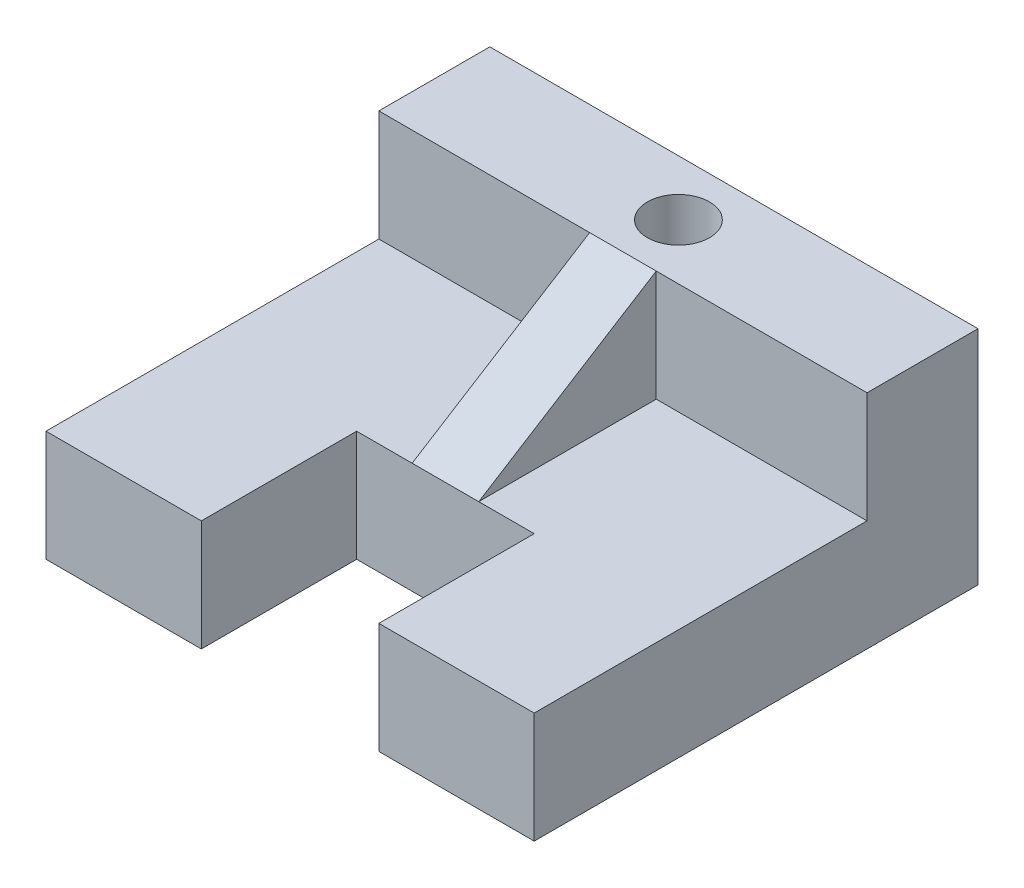
ISO-10303-21;
HEADER;
FILE_DESCRIPTION(('STEP AP214'),'2;1');
FILE_NAME('part.step','',(''),(''),'','','');
FILE_SCHEMA(('AUTOMOTIVE_DESIGN { 1 0 10303 214 1 1 1 1 }'));
ENDSEC;
DATA;
#1=APPLICATION_CONTEXT('core data for automotive mechanical design processes');
#2=APPLICATION_PROTOCOL_DEFINITION('international standard','automotive_design',2000,#1);
#3=PRODUCT_CONTEXT('',#1,'mechanical');
#4=PRODUCT('Part','Part','',(#3));
#5=PRODUCT_RELATED_PRODUCT_CATEGORY('part','',(#4));
#6=PRODUCT_DEFINITION_FORMATION('','',#4);
#7=PRODUCT_DEFINITION_CONTEXT('part definition',#1,'design');
#8=PRODUCT_DEFINITION('design','',#6,#7);
#9=PRODUCT_DEFINITION_SHAPE('','',#8);
#10=(LENGTH_UNIT() NAMED_UNIT(*) SI_UNIT(.MILLI.,.METRE.));
#11=(NAMED_UNIT(*) PLANE_ANGLE_UNIT() SI_UNIT($,.RADIAN.));
#12=(NAMED_UNIT(*) SI_UNIT($,.STERADIAN.) SOLID_ANGLE_UNIT());
#13=UNCERTAINTY_MEASURE_WITH_UNIT(LENGTH_MEASURE(1.E-05),#10,'distance_accuracy_value','');
#14=(GEOMETRIC_REPRESENTATION_CONTEXT(3) GLOBAL_UNCERTAINTY_ASSIGNED_CONTEXT((#13)) GLOBAL_UNIT_ASSIGNED_CONTEXT((#10,
#11,#12)) REPRESENTATION_CONTEXT('',''));
#15=CARTESIAN_POINT('',(0.,0.,0.));
#16=DIRECTION('',(0.,0.,1.));
#17=DIRECTION('',(1.,0.,0.));
#18=AXIS2_PLACEMENT_3D('',#15,#16,#17);
#19=CARTESIAN_POINT('',(0.,25.,0.));
#20=DIRECTION('',(0.,-1.,0.));
#21=DIRECTION('',(0.,0.,-1.));
#22=AXIS2_PLACEMENT_3D('',#19,#20,#21);
#23=PLANE('',#22);
#24=DIRECTION('',(0.,0.,1.));
#25=VECTOR('',#24,1.);
#26=CARTESIAN_POINT('',(-7.5,25.,0.));
#27=LINE('',#26,#25);
#28=CARTESIAN_POINT('',(-7.5,25.,-25.));
#29=VERTEX_POINT('',#28);
#30=CARTESIAN_POINT('',(-7.5,25.,15.));
#31=VERTEX_POINT('',#30);
#32=EDGE_CURVE('E149',#29,#31,#27,.T.);
#33=ORIENTED_EDGE('',*,*,#32,.F.);
#34=DIRECTION('',(1.,0.,0.));
#35=VECTOR('',#34,1.);
#36=CARTESIAN_POINT('',(55.,25.,-25.));
#37=LINE('',#36,#35);
#38=CARTESIAN_POINT('',(-55.,25.,-25.));
#39=VERTEX_POINT('',#38);
#40=EDGE_CURVE('E159',#39,#29,#37,.T.);
#41=ORIENTED_EDGE('',*,*,#40,.F.);
#42=DIRECTION('',(0.,0.,1.));
#43=VECTOR('',#42,1.);
#44=CARTESIAN_POINT('',(-55.,25.,50.));
#45=LINE('',#44,#43);
#46=CARTESIAN_POINT('',(-55.,25.,50.));
#47=VERTEX_POINT('',#46);
#48=EDGE_CURVE('E182',#39,#47,#45,.T.);
#49=ORIENTED_EDGE('',*,*,#48,.T.);
#50=DIRECTION('',(1.,0.,0.));
#51=VECTOR('',#50,1.);
#52=CARTESIAN_POINT('',(-55.,25.,50.));
#53=LINE('',#52,#51);
#54=CARTESIAN_POINT('',(-20.,25.,50.));
#55=VERTEX_POINT('',#54);
#56=EDGE_CURVE('E198',#47,#55,#53,.T.);
#57=ORIENTED_EDGE('',*,*,#56,.T.);
#58=DIRECTION('',(0.,0.,1.));
#59=VECTOR('',#58,1.);
#60=CARTESIAN_POINT('',(-20.,25.,15.));
#61=LINE('',#60,#59);
#62=CARTESIAN_POINT('',(-20.,25.,15.));
#63=VERTEX_POINT('',#62);
#64=EDGE_CURVE('E226',#63,#55,#61,.T.);
#65=ORIENTED_EDGE('',*,*,#64,.F.);
#66=DIRECTION('',(-1.,0.,0.));
#67=VECTOR('',#66,1.);
#68=CARTESIAN_POINT('',(-20.,25.,15.));
#69=LINE('',#68,#67);
#70=EDGE_CURVE('E263',#31,#63,#69,.T.);
#71=ORIENTED_EDGE('',*,*,#70,.F.);
#72=EDGE_LOOP('',(#33,#41,#49,#57,#65,#71));
#73=FACE_BOUND('',#72,.T.);
#74=ADVANCED_FACE('F35',(#73),#23,.F.);
#75=CARTESIAN_POINT('',(55.,50.,-25.));
#76=DIRECTION('',(0.,0.,-1.));
#77=DIRECTION('',(-1.,0.,0.));
#78=AXIS2_PLACEMENT_3D('',#75,#76,#77);
#79=PLANE('',#78);
#80=DIRECTION('',(0.,-1.,0.));
#81=VECTOR('',#80,1.);
#82=CARTESIAN_POINT('',(-7.49999999999999,50.,-25.));
#83=LINE('',#82,#81);
#84=CARTESIAN_POINT('',(-7.5,50.,-25.));
#85=VERTEX_POINT('',#84);
#86=EDGE_CURVE('E147',#85,#29,#83,.T.);
#87=ORIENTED_EDGE('',*,*,#86,.F.);
#88=DIRECTION('',(1.,0.,0.));
#89=VECTOR('',#88,1.);
#90=CARTESIAN_POINT('',(55.,50.,-25.));
#91=LINE('',#90,#89);
#92=CARTESIAN_POINT('',(-55.,50.,-25.));
#93=VERTEX_POINT('',#92);
#94=EDGE_CURVE('E158',#93,#85,#91,.T.);
#95=ORIENTED_EDGE('',*,*,#94,.F.);
#96=DIRECTION('',(0.,-1.,0.));
#97=VECTOR('',#96,1.);
#98=CARTESIAN_POINT('',(-55.,50.,-25.));
#99=LINE('',#98,#97);
#100=EDGE_CURVE('E170',#93,#39,#99,.T.);
#101=ORIENTED_EDGE('',*,*,#100,.T.);
#102=ORIENTED_EDGE('',*,*,#40,.T.);
#103=EDGE_LOOP('',(#87,#95,#101,#102));
#104=FACE_BOUND('',#103,.T.);
#105=ADVANCED_FACE('F156',(#104),#79,.F.);
#106=CARTESIAN_POINT('',(-55.,25.,50.));
#107=DIRECTION('',(0.,0.,-1.));
#108=DIRECTION('',(-1.,0.,0.));
#109=AXIS2_PLACEMENT_3D('',#106,#107,#108);
#110=PLANE('',#109);
#111=CARTESIAN_POINT('',(20.,25.,50.));
#112=VERTEX_POINT('',#111);
#113=CARTESIAN_POINT('',(55.,25.,50.));
#114=VERTEX_POINT('',#113);
#115=EDGE_CURVE('E216',#112,#114,#53,.T.);
#116=ORIENTED_EDGE('',*,*,#115,.F.);
#117=DIRECTION('',(0.,1.,0.));
#118=VECTOR('',#117,1.);
#119=CARTESIAN_POINT('',(20.,0.,50.));
#120=LINE('',#119,#118);
#121=CARTESIAN_POINT('',(20.,0.,50.));
#122=VERTEX_POINT('',#121);
#123=EDGE_CURVE('E233',#122,#112,#120,.T.);
#124=ORIENTED_EDGE('',*,*,#123,.F.);
#125=DIRECTION('',(1.,0.,0.));
#126=VECTOR('',#125,1.);
#127=CARTESIAN_POINT('',(-55.,0.,50.));
#128=LINE('',#127,#126);
#129=CARTESIAN_POINT('',(55.,0.,50.));
#130=VERTEX_POINT('',#129);
#131=EDGE_CURVE('E201',#122,#130,#128,.T.);
#132=ORIENTED_EDGE('',*,*,#131,.T.);
#133=DIRECTION('',(0.,-1.,0.));
#134=VECTOR('',#133,1.);
#135=CARTESIAN_POINT('',(55.,25.,50.));
#136=LINE('',#135,#134);
#137=EDGE_CURVE('E206',#114,#130,#136,.T.);
#138=ORIENTED_EDGE('',*,*,#137,.F.);
#139=EDGE_LOOP('',(#116,#124,#132,#138));
#140=FACE_BOUND('',#139,.T.);
#141=ADVANCED_FACE('F307',(#140),#110,.F.);
#142=CARTESIAN_POINT('',(7.5,25.,-25.));
#143=VERTEX_POINT('',#142);
#144=CARTESIAN_POINT('',(55.,25.,-25.));
#145=VERTEX_POINT('',#144);
#146=EDGE_CURVE('E39',#143,#145,#37,.T.);
#147=ORIENTED_EDGE('',*,*,#146,.F.);
#148=DIRECTION('',(0.,0.,1.));
#149=VECTOR('',#148,1.);
#150=CARTESIAN_POINT('',(7.5,25.,0.));
#151=LINE('',#150,#149);
#152=CARTESIAN_POINT('',(7.5,25.,15.));
#153=VERTEX_POINT('',#152);
#154=EDGE_CURVE('E160',#143,#153,#151,.T.);
#155=ORIENTED_EDGE('',*,*,#154,.T.);
#156=CARTESIAN_POINT('',(20.,25.,15.));
#157=VERTEX_POINT('',#156);
#158=EDGE_CURVE('E264',#157,#153,#69,.T.);
#159=ORIENTED_EDGE('',*,*,#158,.F.);
#160=DIRECTION('',(0.,0.,-1.));
#161=VECTOR('',#160,1.);
#162=CARTESIAN_POINT('',(20.,25.,15.));
#163=LINE('',#162,#161);
#164=EDGE_CURVE('E141',#112,#157,#163,.T.);
#165=ORIENTED_EDGE('',*,*,#164,.F.);
#166=ORIENTED_EDGE('',*,*,#115,.T.);
#167=DIRECTION('',(0.,0.,-1.));
#168=VECTOR('',#167,1.);
#169=CARTESIAN_POINT('',(55.,25.,50.));
#170=LINE('',#169,#168);
#171=EDGE_CURVE('E205',#114,#145,#170,.T.);
#172=ORIENTED_EDGE('',*,*,#171,.T.);
#173=EDGE_LOOP('',(#147,#155,#159,#165,#166,#172));
#174=FACE_BOUND('',#173,.T.);
#175=ADVANCED_FACE('F303',(#174),#23,.F.);
#176=CARTESIAN_POINT('',(55.,25.,50.));
#177=DIRECTION('',(-1.,0.,0.));
#178=DIRECTION('',(0.,0.,1.));
#179=AXIS2_PLACEMENT_3D('',#176,#177,#178);
#180=PLANE('',#179);
#181=DIRECTION('',(0.,0.,-1.));
#182=VECTOR('',#181,1.);
#183=CARTESIAN_POINT('',(55.,0.,50.));
#184=LINE('',#183,#182);
#185=CARTESIAN_POINT('',(55.,0.,-50.));
#186=VERTEX_POINT('',#185);
#187=EDGE_CURVE('E187',#130,#186,#184,.T.);
#188=ORIENTED_EDGE('',*,*,#187,.T.);
#189=DIRECTION('',(0.,-1.,0.));
#190=VECTOR('',#189,1.);
#191=CARTESIAN_POINT('',(55.,25.,-50.));
#192=LINE('',#191,#190);
#193=CARTESIAN_POINT('',(55.,50.,-50.));
#194=VERTEX_POINT('',#193);
#195=EDGE_CURVE('E11',#194,#186,#192,.T.);
#196=ORIENTED_EDGE('',*,*,#195,.F.);
#197=DIRECTION('',(0.,0.,-1.));
#198=VECTOR('',#197,1.);
#199=CARTESIAN_POINT('',(55.,50.,-50.));
#200=LINE('',#199,#198);
#201=CARTESIAN_POINT('',(55.,50.,-25.));
#202=VERTEX_POINT('',#201);
#203=EDGE_CURVE('E181',#202,#194,#200,.T.);
#204=ORIENTED_EDGE('',*,*,#203,.F.);
#205=DIRECTION('',(0.,-1.,0.));
#206=VECTOR('',#205,1.);
#207=CARTESIAN_POINT('',(55.,50.,-25.));
#208=LINE('',#207,#206);
#209=EDGE_CURVE('E166',#202,#145,#208,.T.);
#210=ORIENTED_EDGE('',*,*,#209,.T.);
#211=ORIENTED_EDGE('',*,*,#171,.F.);
#212=ORIENTED_EDGE('',*,*,#137,.T.);
#213=EDGE_LOOP('',(#188,#196,#204,#210,#211,#212));
#214=FACE_BOUND('',#213,.T.);
#215=ADVANCED_FACE('F37',(#214),#180,.F.);
#216=CARTESIAN_POINT('',(-55.,25.,-50.));
#217=DIRECTION('',(0.,0.,1.));
#218=DIRECTION('',(1.,0.,0.));
#219=AXIS2_PLACEMENT_3D('',#216,#217,#218);
#220=PLANE('',#219);
#221=DIRECTION('',(-1.,0.,0.));
#222=VECTOR('',#221,1.);
#223=CARTESIAN_POINT('',(-55.,0.,-50.));
#224=LINE('',#223,#222);
#225=CARTESIAN_POINT('',(-55.,0.,-50.));
#226=VERTEX_POINT('',#225);
#227=EDGE_CURVE('E190',#186,#226,#224,.T.);
#228=ORIENTED_EDGE('',*,*,#227,.T.);
#229=DIRECTION('',(0.,-1.,0.));
#230=VECTOR('',#229,1.);
#231=CARTESIAN_POINT('',(-55.,25.,-50.));
#232=LINE('',#231,#230);
#233=CARTESIAN_POINT('',(-55.,50.,-50.));
#234=VERTEX_POINT('',#233);
#235=EDGE_CURVE('E45',#234,#226,#232,.T.);
#236=ORIENTED_EDGE('',*,*,#235,.F.);
#237=DIRECTION('',(-1.,0.,0.));
#238=VECTOR('',#237,1.);
#239=CARTESIAN_POINT('',(55.,50.,-50.));
#240=LINE('',#239,#238);
#241=EDGE_CURVE('E245',#194,#234,#240,.T.);
#242=ORIENTED_EDGE('',*,*,#241,.F.);
#243=ORIENTED_EDGE('',*,*,#195,.T.);
#244=EDGE_LOOP('',(#228,#236,#242,#243));
#245=FACE_BOUND('',#244,.T.);
#246=ADVANCED_FACE('F250',(#245),#220,.F.);
#247=CARTESIAN_POINT('',(-55.,25.,50.));
#248=DIRECTION('',(1.,0.,0.));
#249=DIRECTION('',(0.,0.,-1.));
#250=AXIS2_PLACEMENT_3D('',#247,#248,#249);
#251=PLANE('',#250);
#252=DIRECTION('',(0.,0.,1.));
#253=VECTOR('',#252,1.);
#254=CARTESIAN_POINT('',(-55.,0.,50.));
#255=LINE('',#254,#253);
#256=CARTESIAN_POINT('',(-55.,0.,50.));
#257=VERTEX_POINT('',#256);
#258=EDGE_CURVE('E195',#226,#257,#255,.T.);
#259=ORIENTED_EDGE('',*,*,#258,.T.);
#260=DIRECTION('',(0.,-1.,0.));
#261=VECTOR('',#260,1.);
#262=CARTESIAN_POINT('',(-55.,25.,50.));
#263=LINE('',#262,#261);
#264=EDGE_CURVE('E208',#47,#257,#263,.T.);
#265=ORIENTED_EDGE('',*,*,#264,.F.);
#266=ORIENTED_EDGE('',*,*,#48,.F.);
#267=ORIENTED_EDGE('',*,*,#100,.F.);
#268=DIRECTION('',(0.,0.,1.));
#269=VECTOR('',#268,1.);
#270=CARTESIAN_POINT('',(-55.,50.,-50.));
#271=LINE('',#270,#269);
#272=EDGE_CURVE('E164',#234,#93,#271,.T.);
#273=ORIENTED_EDGE('',*,*,#272,.F.);
#274=ORIENTED_EDGE('',*,*,#235,.T.);
#275=EDGE_LOOP('',(#259,#265,#266,#267,#273,#274));
#276=FACE_BOUND('',#275,.T.);
#277=ADVANCED_FACE('F253',(#276),#251,.F.);
#278=CARTESIAN_POINT('',(-20.,0.,50.));
#279=VERTEX_POINT('',#278);
#280=EDGE_CURVE('E202',#257,#279,#128,.T.);
#281=ORIENTED_EDGE('',*,*,#280,.T.);
#282=DIRECTION('',(0.,1.,0.));
#283=VECTOR('',#282,1.);
#284=CARTESIAN_POINT('',(-20.,0.,50.));
#285=LINE('',#284,#283);
#286=EDGE_CURVE('E231',#279,#55,#285,.T.);
#287=ORIENTED_EDGE('',*,*,#286,.T.);
#288=ORIENTED_EDGE('',*,*,#56,.F.);
#289=ORIENTED_EDGE('',*,*,#264,.T.);
#290=EDGE_LOOP('',(#281,#287,#288,#289));
#291=FACE_BOUND('',#290,.T.);
#292=ADVANCED_FACE('F229',(#291),#110,.F.);
#293=CARTESIAN_POINT('',(0.,0.,0.));
#294=DIRECTION('',(0.,-1.,0.));
#295=DIRECTION('',(0.,0.,-1.));
#296=AXIS2_PLACEMENT_3D('',#293,#294,#295);
#297=PLANE('',#296);
#298=CARTESIAN_POINT('',(0.,0.,-37.5));
#299=DIRECTION('',(0.,1.,0.));
#300=DIRECTION('',(0.,0.,1.));
#301=AXIS2_PLACEMENT_3D('',#298,#299,#300);
#302=CIRCLE('',#301,7.);
#303=CARTESIAN_POINT('',(0.,0.,-30.5));
#304=VERTEX_POINT('',#303);
#305=EDGE_CURVE('E151',#304,#304,#302,.T.);
#306=ORIENTED_EDGE('',*,*,#305,.T.);
#307=EDGE_LOOP('',(#306));
#308=FACE_BOUND('',#307,.T.);
#309=DIRECTION('',(-1.,0.,0.));
#310=VECTOR('',#309,1.);
#311=CARTESIAN_POINT('',(-20.,0.,15.));
#312=LINE('',#311,#310);
#313=CARTESIAN_POINT('',(20.,0.,15.));
#314=VERTEX_POINT('',#313);
#315=CARTESIAN_POINT('',(-20.,0.,15.));
#316=VERTEX_POINT('',#315);
#317=EDGE_CURVE('E61',#314,#316,#312,.T.);
#318=ORIENTED_EDGE('',*,*,#317,.T.);
#319=DIRECTION('',(0.,0.,1.));
#320=VECTOR('',#319,1.);
#321=CARTESIAN_POINT('',(-20.,0.,15.));
#322=LINE('',#321,#320);
#323=EDGE_CURVE('E243',#316,#279,#322,.T.);
#324=ORIENTED_EDGE('',*,*,#323,.T.);
#325=ORIENTED_EDGE('',*,*,#280,.F.);
#326=ORIENTED_EDGE('',*,*,#258,.F.);
#327=ORIENTED_EDGE('',*,*,#227,.F.);
#328=ORIENTED_EDGE('',*,*,#187,.F.);
#329=ORIENTED_EDGE('',*,*,#131,.F.);
#330=DIRECTION('',(0.,0.,-1.));
#331=VECTOR('',#330,1.);
#332=CARTESIAN_POINT('',(20.,0.,15.));
#333=LINE('',#332,#331);
#334=EDGE_CURVE('E257',#122,#314,#333,.T.);
#335=ORIENTED_EDGE('',*,*,#334,.T.);
#336=EDGE_LOOP('',(#318,#324,#325,#326,#327,#328,#329,#335));
#337=FACE_BOUND('',#336,.T.);
#338=ADVANCED_FACE('F254',(#308,#337),#297,.T.);
#339=CARTESIAN_POINT('',(7.5,50.,-25.));
#340=VERTEX_POINT('',#339);
#341=EDGE_CURVE('E167',#340,#202,#91,.T.);
#342=ORIENTED_EDGE('',*,*,#341,.F.);
#343=DIRECTION('',(0.,-1.,0.));
#344=VECTOR('',#343,1.);
#345=CARTESIAN_POINT('',(7.5,50.,-25.));
#346=LINE('',#345,#344);
#347=EDGE_CURVE('E142',#340,#143,#346,.T.);
#348=ORIENTED_EDGE('',*,*,#347,.T.);
#349=ORIENTED_EDGE('',*,*,#146,.T.);
#350=ORIENTED_EDGE('',*,*,#209,.F.);
#351=EDGE_LOOP('',(#342,#348,#349,#350));
#352=FACE_BOUND('',#351,.T.);
#353=ADVANCED_FACE('F290',(#352),#79,.F.);
#354=CARTESIAN_POINT('',(0.,50.,0.));
#355=DIRECTION('',(0.,-1.,0.));
#356=DIRECTION('',(0.,0.,-1.));
#357=AXIS2_PLACEMENT_3D('',#354,#355,#356);
#358=PLANE('',#357);
#359=CARTESIAN_POINT('',(0.,50.,-37.5));
#360=DIRECTION('',(0.,1.,0.));
#361=DIRECTION('',(0.,0.,1.));
#362=AXIS2_PLACEMENT_3D('',#359,#360,#361);
#363=CIRCLE('',#362,7.);
#364=CARTESIAN_POINT('',(0.,50.,-30.5));
#365=VERTEX_POINT('',#364);
#366=EDGE_CURVE('E275',#365,#365,#363,.T.);
#367=ORIENTED_EDGE('',*,*,#366,.F.);
#368=EDGE_LOOP('',(#367));
#369=FACE_BOUND('',#368,.T.);
#370=ORIENTED_EDGE('',*,*,#241,.T.);
#371=ORIENTED_EDGE('',*,*,#272,.T.);
#372=ORIENTED_EDGE('',*,*,#94,.T.);
#373=DIRECTION('',(-1.,0.,0.));
#374=VECTOR('',#373,1.);
#375=CARTESIAN_POINT('',(0.,50.,-25.));
#376=LINE('',#375,#374);
#377=EDGE_CURVE('E134',#340,#85,#376,.T.);
#378=ORIENTED_EDGE('',*,*,#377,.F.);
#379=ORIENTED_EDGE('',*,*,#341,.T.);
#380=ORIENTED_EDGE('',*,*,#203,.T.);
#381=EDGE_LOOP('',(#370,#371,#372,#378,#379,#380));
#382=FACE_BOUND('',#381,.T.);
#383=ADVANCED_FACE('F162',(#369,#382),#358,.F.);
#384=CARTESIAN_POINT('',(20.,0.,15.));
#385=DIRECTION('',(1.,0.,0.));
#386=DIRECTION('',(0.,0.,-1.));
#387=AXIS2_PLACEMENT_3D('',#384,#385,#386);
#388=PLANE('',#387);
#389=ORIENTED_EDGE('',*,*,#164,.T.);
#390=DIRECTION('',(0.,1.,0.));
#391=VECTOR('',#390,1.);
#392=CARTESIAN_POINT('',(20.,0.,15.));
#393=LINE('',#392,#391);
#394=EDGE_CURVE('E238',#314,#157,#393,.T.);
#395=ORIENTED_EDGE('',*,*,#394,.F.);
#396=ORIENTED_EDGE('',*,*,#334,.F.);
#397=ORIENTED_EDGE('',*,*,#123,.T.);
#398=EDGE_LOOP('',(#389,#395,#396,#397));
#399=FACE_BOUND('',#398,.T.);
#400=ADVANCED_FACE('F289',(#399),#388,.F.);
#401=CARTESIAN_POINT('',(-20.,0.,15.));
#402=DIRECTION('',(-1.,0.,0.));
#403=DIRECTION('',(0.,0.,1.));
#404=AXIS2_PLACEMENT_3D('',#401,#402,#403);
#405=PLANE('',#404);
#406=ORIENTED_EDGE('',*,*,#64,.T.);
#407=ORIENTED_EDGE('',*,*,#286,.F.);
#408=ORIENTED_EDGE('',*,*,#323,.F.);
#409=DIRECTION('',(0.,1.,0.));
#410=VECTOR('',#409,1.);
#411=CARTESIAN_POINT('',(-20.,0.,15.));
#412=LINE('',#411,#410);
#413=EDGE_CURVE('E234',#316,#63,#412,.T.);
#414=ORIENTED_EDGE('',*,*,#413,.T.);
#415=EDGE_LOOP('',(#406,#407,#408,#414));
#416=FACE_BOUND('',#415,.T.);
#417=ADVANCED_FACE('F296',(#416),#405,.F.);
#418=CARTESIAN_POINT('',(-20.,0.,15.));
#419=DIRECTION('',(0.,0.,-1.));
#420=DIRECTION('',(-1.,0.,0.));
#421=AXIS2_PLACEMENT_3D('',#418,#419,#420);
#422=PLANE('',#421);
#423=ORIENTED_EDGE('',*,*,#158,.T.);
#424=EDGE_CURVE('E266',#153,#31,#69,.T.);
#425=ORIENTED_EDGE('',*,*,#424,.T.);
#426=ORIENTED_EDGE('',*,*,#70,.T.);
#427=ORIENTED_EDGE('',*,*,#413,.F.);
#428=ORIENTED_EDGE('',*,*,#317,.F.);
#429=ORIENTED_EDGE('',*,*,#394,.T.);
#430=EDGE_LOOP('',(#423,#425,#426,#427,#428,#429));
#431=FACE_BOUND('',#430,.T.);
#432=ADVANCED_FACE('F321',(#431),#422,.F.);
#433=CARTESIAN_POINT('',(7.5,25.0000125,1.24999999934206E-05));
#434=DIRECTION('',(1.,0.,0.));
#435=DIRECTION('',(0.,0.,-1.));
#436=AXIS2_PLACEMENT_3D('',#433,#434,#435);
#437=PLANE('',#436);
#438=ORIENTED_EDGE('',*,*,#347,.F.);
#439=DIRECTION('',(0.,-0.52999894000318,0.847998304005088));
#440=VECTOR('',#439,1.);
#441=CARTESIAN_POINT('',(7.5,50.,-25.));
#442=LINE('',#441,#440);
#443=EDGE_CURVE('E137',#340,#153,#442,.T.);
#444=ORIENTED_EDGE('',*,*,#443,.T.);
#445=ORIENTED_EDGE('',*,*,#154,.F.);
#446=EDGE_LOOP('',(#438,#444,#445));
#447=FACE_BOUND('',#446,.T.);
#448=ADVANCED_FACE('F319',(#447),#437,.T.);
#449=CARTESIAN_POINT('',(-7.5,25.0000125,1.24999999934206E-05));
#450=DIRECTION('',(1.,0.,0.));
#451=DIRECTION('',(0.,0.,-1.));
#452=AXIS2_PLACEMENT_3D('',#449,#450,#451);
#453=PLANE('',#452);
#454=DIRECTION('',(0.,-0.52999894000318,0.847998304005088));
#455=VECTOR('',#454,1.);
#456=CARTESIAN_POINT('',(-7.5,50.,-25.));
#457=LINE('',#456,#455);
#458=EDGE_CURVE('E53',#85,#31,#457,.T.);
#459=ORIENTED_EDGE('',*,*,#458,.F.);
#460=ORIENTED_EDGE('',*,*,#86,.T.);
#461=ORIENTED_EDGE('',*,*,#32,.T.);
#462=EDGE_LOOP('',(#459,#460,#461));
#463=FACE_BOUND('',#462,.T.);
#464=ADVANCED_FACE('F146',(#463),#453,.F.);
#465=CARTESIAN_POINT('',(0.,50.,-25.));
#466=DIRECTION('',(0.,0.847998304005088,0.52999894000318));
#467=DIRECTION('',(0.,-0.52999894000318,0.847998304005088));
#468=AXIS2_PLACEMENT_3D('',#465,#466,#467);
#469=PLANE('',#468);
#470=ORIENTED_EDGE('',*,*,#443,.F.);
#471=ORIENTED_EDGE('',*,*,#377,.T.);
#472=ORIENTED_EDGE('',*,*,#458,.T.);
#473=ORIENTED_EDGE('',*,*,#424,.F.);
#474=EDGE_LOOP('',(#470,#471,#472,#473));
#475=FACE_BOUND('',#474,.T.);
#476=ADVANCED_FACE('F135',(#475),#469,.T.);
#477=CARTESIAN_POINT('',(0.,0.,-37.5));
#478=DIRECTION('',(0.,1.,0.));
#479=DIRECTION('',(0.,0.,1.));
#480=AXIS2_PLACEMENT_3D('',#477,#478,#479);
#481=CYLINDRICAL_SURFACE('',#480,7.);
#482=ORIENTED_EDGE('',*,*,#305,.F.);
#483=EDGE_LOOP('',(#482));
#484=FACE_BOUND('',#483,.T.);
#485=ORIENTED_EDGE('',*,*,#366,.T.);
#486=EDGE_LOOP('',(#485));
#487=FACE_BOUND('',#486,.T.);
#488=ADVANCED_FACE('F282',(#484,#487),#481,.F.);
#489=CLOSED_SHELL('',(#74,#105,#141,#175,#215,#246,#277,#292,#338,#353,#383,#400,#417,#432,#448,
#464,#476,#488));
#490=MANIFOLD_SOLID_BREP('B2',#489);
#491=ADVANCED_BREP_SHAPE_REPRESENTATION('',(#18,#490),#14);
#492=SHAPE_DEFINITION_REPRESENTATION(#9,#491);
ENDSEC;
END-ISO-10303-21;
